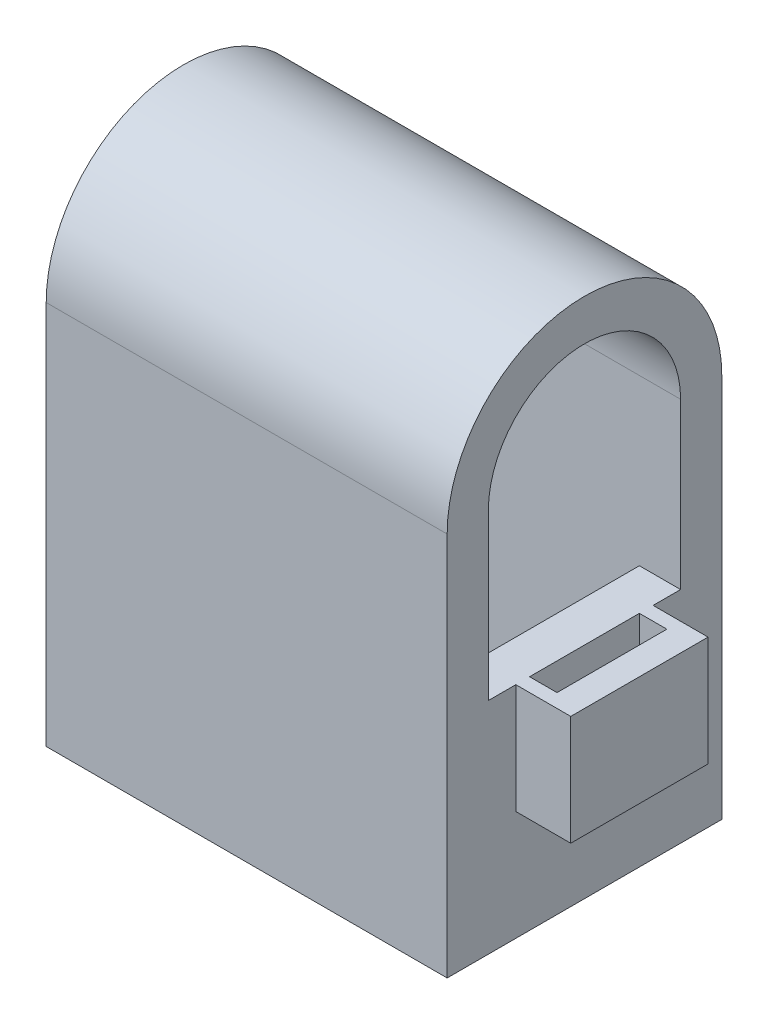
ISO-10303-21;
HEADER;
FILE_DESCRIPTION(('STEP AP214'),'2;1');
FILE_NAME('part.step','',(''),(''),'','','');
FILE_SCHEMA(('AUTOMOTIVE_DESIGN { 1 0 10303 214 1 1 1 1 }'));
ENDSEC;
DATA;
#1=APPLICATION_CONTEXT('core data for automotive mechanical design processes');
#2=APPLICATION_PROTOCOL_DEFINITION('international standard','automotive_design',2000,#1);
#3=PRODUCT_CONTEXT('',#1,'mechanical');
#4=PRODUCT('Part','Part','',(#3));
#5=PRODUCT_RELATED_PRODUCT_CATEGORY('part','',(#4));
#6=PRODUCT_DEFINITION_FORMATION('','',#4);
#7=PRODUCT_DEFINITION_CONTEXT('part definition',#1,'design');
#8=PRODUCT_DEFINITION('design','',#6,#7);
#9=PRODUCT_DEFINITION_SHAPE('','',#8);
#10=(LENGTH_UNIT() NAMED_UNIT(*) SI_UNIT(.MILLI.,.METRE.));
#11=(NAMED_UNIT(*) PLANE_ANGLE_UNIT() SI_UNIT($,.RADIAN.));
#12=(NAMED_UNIT(*) SI_UNIT($,.STERADIAN.) SOLID_ANGLE_UNIT());
#13=UNCERTAINTY_MEASURE_WITH_UNIT(LENGTH_MEASURE(1.E-05),#10,'distance_accuracy_value','');
#14=(GEOMETRIC_REPRESENTATION_CONTEXT(3) GLOBAL_UNCERTAINTY_ASSIGNED_CONTEXT((#13)) GLOBAL_UNIT_ASSIGNED_CONTEXT((#10,
#11,#12)) REPRESENTATION_CONTEXT('',''));
#15=CARTESIAN_POINT('',(0.,0.,0.));
#16=DIRECTION('',(0.,0.,1.));
#17=DIRECTION('',(1.,0.,0.));
#18=AXIS2_PLACEMENT_3D('',#15,#16,#17);
#19=CARTESIAN_POINT('',(9.271,-8.89,-1.905));
#20=DIRECTION('',(1.,0.,0.));
#21=DIRECTION('',(0.,0.,-1.));
#22=AXIS2_PLACEMENT_3D('',#19,#20,#21);
#23=PLANE('',#22);
#24=DIRECTION('',(0.,0.,-1.));
#25=VECTOR('',#24,1.);
#26=CARTESIAN_POINT('',(9.271,-3.81,-3.175));
#27=LINE('',#26,#25);
#28=CARTESIAN_POINT('',(9.271,-3.81,-8.89));
#29=VERTEX_POINT('',#28);
#30=CARTESIAN_POINT('',(9.271,-3.81,-9.525));
#31=VERTEX_POINT('',#30);
#32=EDGE_CURVE('E214',#29,#31,#27,.T.);
#33=ORIENTED_EDGE('',*,*,#32,.F.);
#34=DIRECTION('',(0.,1.,0.));
#35=VECTOR('',#34,1.);
#36=CARTESIAN_POINT('',(9.271,-8.89,-8.89));
#37=LINE('',#36,#35);
#38=CARTESIAN_POINT('',(9.271,1.27,-8.89));
#39=VERTEX_POINT('',#38);
#40=EDGE_CURVE('E177',#29,#39,#37,.T.);
#41=ORIENTED_EDGE('',*,*,#40,.T.);
#42=DIRECTION('',(0.,0.,1.));
#43=VECTOR('',#42,1.);
#44=CARTESIAN_POINT('',(9.271,1.27,-8.89));
#45=LINE('',#44,#43);
#46=CARTESIAN_POINT('',(9.271,1.27,-3.81));
#47=VERTEX_POINT('',#46);
#48=EDGE_CURVE('E180',#39,#47,#45,.T.);
#49=ORIENTED_EDGE('',*,*,#48,.T.);
#50=DIRECTION('',(0.,1.,0.));
#51=VECTOR('',#50,1.);
#52=CARTESIAN_POINT('',(9.271,-8.89,-3.81));
#53=LINE('',#52,#51);
#54=CARTESIAN_POINT('',(9.271,-3.81,-3.81));
#55=VERTEX_POINT('',#54);
#56=EDGE_CURVE('E55',#55,#47,#53,.T.);
#57=ORIENTED_EDGE('',*,*,#56,.F.);
#58=CARTESIAN_POINT('',(9.271,-3.81,-3.175));
#59=VERTEX_POINT('',#58);
#60=EDGE_CURVE('E202',#59,#55,#27,.T.);
#61=ORIENTED_EDGE('',*,*,#60,.F.);
#62=DIRECTION('',(0.,-1.,0.));
#63=VECTOR('',#62,1.);
#64=CARTESIAN_POINT('',(9.271,-3.81,-3.175));
#65=LINE('',#64,#63);
#66=CARTESIAN_POINT('',(9.271,1.27,-3.175));
#67=VERTEX_POINT('',#66);
#68=EDGE_CURVE('E211',#67,#59,#65,.T.);
#69=ORIENTED_EDGE('',*,*,#68,.F.);
#70=DIRECTION('',(0.,0.,1.));
#71=VECTOR('',#70,1.);
#72=CARTESIAN_POINT('',(9.271,1.27,-1.905));
#73=LINE('',#72,#71);
#74=CARTESIAN_POINT('',(9.271,1.27,-1.905));
#75=VERTEX_POINT('',#74);
#76=EDGE_CURVE('E227',#67,#75,#73,.T.);
#77=ORIENTED_EDGE('',*,*,#76,.T.);
#78=DIRECTION('',(0.,1.,0.));
#79=VECTOR('',#78,1.);
#80=CARTESIAN_POINT('',(9.271,-8.89,-1.905));
#81=LINE('',#80,#79);
#82=CARTESIAN_POINT('',(9.271,8.89,-1.905));
#83=VERTEX_POINT('',#82);
#84=EDGE_CURVE('E299',#75,#83,#81,.T.);
#85=ORIENTED_EDGE('',*,*,#84,.T.);
#86=CARTESIAN_POINT('',(9.271,8.89,-6.35));
#87=DIRECTION('',(1.,0.,0.));
#88=DIRECTION('',(0.,0.,-1.));
#89=AXIS2_PLACEMENT_3D('',#86,#87,#88);
#90=CIRCLE('',#89,4.445);
#91=CARTESIAN_POINT('',(9.271,8.89,-10.795));
#92=VERTEX_POINT('',#91);
#93=EDGE_CURVE('E289',#92,#83,#90,.T.);
#94=ORIENTED_EDGE('',*,*,#93,.F.);
#95=DIRECTION('',(0.,1.,0.));
#96=VECTOR('',#95,1.);
#97=CARTESIAN_POINT('',(9.271,-8.89,-10.795));
#98=LINE('',#97,#96);
#99=CARTESIAN_POINT('',(9.271,1.27,-10.795));
#100=VERTEX_POINT('',#99);
#101=EDGE_CURVE('E273',#100,#92,#98,.T.);
#102=ORIENTED_EDGE('',*,*,#101,.F.);
#103=CARTESIAN_POINT('',(9.271,1.27,-9.525));
#104=VERTEX_POINT('',#103);
#105=EDGE_CURVE('E231',#100,#104,#73,.T.);
#106=ORIENTED_EDGE('',*,*,#105,.T.);
#107=DIRECTION('',(0.,1.,0.));
#108=VECTOR('',#107,1.);
#109=CARTESIAN_POINT('',(9.271,-3.81,-9.525));
#110=LINE('',#109,#108);
#111=EDGE_CURVE('E195',#31,#104,#110,.T.);
#112=ORIENTED_EDGE('',*,*,#111,.F.);
#113=EDGE_LOOP('',(#33,#41,#49,#57,#61,#69,#77,#85,#94,#102,#106,#112));
#114=FACE_BOUND('',#113,.T.);
#115=DIRECTION('',(0.,1.,0.));
#116=VECTOR('',#115,1.);
#117=CARTESIAN_POINT('',(9.271,-8.89,0.));
#118=LINE('',#117,#116);
#119=CARTESIAN_POINT('',(9.271,-8.89,0.));
#120=VERTEX_POINT('',#119);
#121=CARTESIAN_POINT('',(9.271,8.89,0.));
#122=VERTEX_POINT('',#121);
#123=EDGE_CURVE('E292',#120,#122,#118,.T.);
#124=ORIENTED_EDGE('',*,*,#123,.F.);
#125=DIRECTION('',(0.,0.,1.));
#126=VECTOR('',#125,1.);
#127=CARTESIAN_POINT('',(9.271,-8.89,-1.905));
#128=LINE('',#127,#126);
#129=CARTESIAN_POINT('',(9.271,-8.89,-12.7));
#130=VERTEX_POINT('',#129);
#131=EDGE_CURVE('E321',#130,#120,#128,.T.);
#132=ORIENTED_EDGE('',*,*,#131,.F.);
#133=DIRECTION('',(0.,1.,0.));
#134=VECTOR('',#133,1.);
#135=CARTESIAN_POINT('',(9.271,-8.89,-12.7));
#136=LINE('',#135,#134);
#137=CARTESIAN_POINT('',(9.271,8.89,-12.7));
#138=VERTEX_POINT('',#137);
#139=EDGE_CURVE('E271',#130,#138,#136,.T.);
#140=ORIENTED_EDGE('',*,*,#139,.T.);
#141=CARTESIAN_POINT('',(9.271,8.89,-6.35));
#142=DIRECTION('',(1.,0.,0.));
#143=DIRECTION('',(0.,0.,-1.));
#144=AXIS2_PLACEMENT_3D('',#141,#142,#143);
#145=CIRCLE('',#144,6.35);
#146=EDGE_CURVE('E286',#122,#138,#145,.F.);
#147=ORIENTED_EDGE('',*,*,#146,.F.);
#148=EDGE_LOOP('',(#124,#132,#140,#147));
#149=FACE_BOUND('',#148,.T.);
#150=ADVANCED_FACE('F33',(#114,#149),#23,.T.);
#151=CARTESIAN_POINT('',(-9.271,-8.89,-1.905));
#152=DIRECTION('',(0.,-1.,0.));
#153=DIRECTION('',(0.,0.,-1.));
#154=AXIS2_PLACEMENT_3D('',#151,#152,#153);
#155=PLANE('',#154);
#156=DIRECTION('',(1.,0.,0.));
#157=VECTOR('',#156,1.);
#158=CARTESIAN_POINT('',(9.271,-8.89,-12.7));
#159=LINE('',#158,#157);
#160=CARTESIAN_POINT('',(-9.271,-8.89,-12.7));
#161=VERTEX_POINT('',#160);
#162=EDGE_CURVE('E278',#161,#130,#159,.T.);
#163=ORIENTED_EDGE('',*,*,#162,.T.);
#164=ORIENTED_EDGE('',*,*,#131,.T.);
#165=DIRECTION('',(1.,0.,0.));
#166=VECTOR('',#165,1.);
#167=CARTESIAN_POINT('',(-9.271,-8.89,0.));
#168=LINE('',#167,#166);
#169=CARTESIAN_POINT('',(-9.271,-8.89,0.));
#170=VERTEX_POINT('',#169);
#171=EDGE_CURVE('E302',#170,#120,#168,.T.);
#172=ORIENTED_EDGE('',*,*,#171,.F.);
#173=DIRECTION('',(0.,0.,1.));
#174=VECTOR('',#173,1.);
#175=CARTESIAN_POINT('',(-9.271,-8.89,-1.905));
#176=LINE('',#175,#174);
#177=EDGE_CURVE('E310',#161,#170,#176,.T.);
#178=ORIENTED_EDGE('',*,*,#177,.F.);
#179=EDGE_LOOP('',(#163,#164,#172,#178));
#180=FACE_BOUND('',#179,.T.);
#181=DIRECTION('',(1.,0.,0.));
#182=VECTOR('',#181,1.);
#183=CARTESIAN_POINT('',(-9.271,-8.89,-1.905));
#184=LINE('',#183,#182);
#185=CARTESIAN_POINT('',(-7.366,-8.89,-1.905));
#186=VERTEX_POINT('',#185);
#187=CARTESIAN_POINT('',(7.366,-8.89,-1.905));
#188=VERTEX_POINT('',#187);
#189=EDGE_CURVE('E307',#186,#188,#184,.T.);
#190=ORIENTED_EDGE('',*,*,#189,.T.);
#191=DIRECTION('',(0.,0.,-1.));
#192=VECTOR('',#191,1.);
#193=CARTESIAN_POINT('',(7.366,-8.89,-1.905));
#194=LINE('',#193,#192);
#195=CARTESIAN_POINT('',(7.366,-8.89,-10.795));
#196=VERTEX_POINT('',#195);
#197=EDGE_CURVE('E237',#188,#196,#194,.T.);
#198=ORIENTED_EDGE('',*,*,#197,.T.);
#199=DIRECTION('',(1.,0.,0.));
#200=VECTOR('',#199,1.);
#201=CARTESIAN_POINT('',(9.271,-8.89,-10.795));
#202=LINE('',#201,#200);
#203=CARTESIAN_POINT('',(-7.366,-8.89,-10.795));
#204=VERTEX_POINT('',#203);
#205=EDGE_CURVE('E270',#204,#196,#202,.T.);
#206=ORIENTED_EDGE('',*,*,#205,.F.);
#207=DIRECTION('',(0.,0.,1.));
#208=VECTOR('',#207,1.);
#209=CARTESIAN_POINT('',(-7.366,-8.89,-10.795));
#210=LINE('',#209,#208);
#211=EDGE_CURVE('E250',#204,#186,#210,.T.);
#212=ORIENTED_EDGE('',*,*,#211,.T.);
#213=EDGE_LOOP('',(#190,#198,#206,#212));
#214=FACE_BOUND('',#213,.T.);
#215=ADVANCED_FACE('F343',(#180,#214),#155,.T.);
#216=CARTESIAN_POINT('',(-9.271,-8.89,-1.905));
#217=DIRECTION('',(-1.,0.,0.));
#218=DIRECTION('',(0.,0.,1.));
#219=AXIS2_PLACEMENT_3D('',#216,#217,#218);
#220=PLANE('',#219);
#221=DIRECTION('',(0.,-1.,0.));
#222=VECTOR('',#221,1.);
#223=CARTESIAN_POINT('',(-9.271,-8.89,-1.905));
#224=LINE('',#223,#222);
#225=CARTESIAN_POINT('',(-9.271,8.89,-1.905));
#226=VERTEX_POINT('',#225);
#227=CARTESIAN_POINT('',(-9.271,1.27,-1.905));
#228=VERTEX_POINT('',#227);
#229=EDGE_CURVE('E304',#226,#228,#224,.T.);
#230=ORIENTED_EDGE('',*,*,#229,.T.);
#231=DIRECTION('',(0.,0.,-1.));
#232=VECTOR('',#231,1.);
#233=CARTESIAN_POINT('',(-9.271,1.27,-10.795));
#234=LINE('',#233,#232);
#235=CARTESIAN_POINT('',(-9.271,1.27,-10.795));
#236=VERTEX_POINT('',#235);
#237=EDGE_CURVE('E245',#228,#236,#234,.T.);
#238=ORIENTED_EDGE('',*,*,#237,.T.);
#239=DIRECTION('',(0.,-1.,0.));
#240=VECTOR('',#239,1.);
#241=CARTESIAN_POINT('',(-9.271,-8.89,-10.795));
#242=LINE('',#241,#240);
#243=CARTESIAN_POINT('',(-9.271,8.89,-10.795));
#244=VERTEX_POINT('',#243);
#245=EDGE_CURVE('E268',#244,#236,#242,.T.);
#246=ORIENTED_EDGE('',*,*,#245,.F.);
#247=CARTESIAN_POINT('',(-9.271,8.89,-6.35));
#248=DIRECTION('',(1.,0.,0.));
#249=DIRECTION('',(0.,0.,-1.));
#250=AXIS2_PLACEMENT_3D('',#247,#248,#249);
#251=CIRCLE('',#250,4.445);
#252=EDGE_CURVE('E275',#244,#226,#251,.T.);
#253=ORIENTED_EDGE('',*,*,#252,.T.);
#254=EDGE_LOOP('',(#230,#238,#246,#253));
#255=FACE_BOUND('',#254,.T.);
#256=DIRECTION('',(0.,-1.,0.));
#257=VECTOR('',#256,1.);
#258=CARTESIAN_POINT('',(-9.271,-8.89,0.));
#259=LINE('',#258,#257);
#260=CARTESIAN_POINT('',(-9.271,8.89,0.));
#261=VERTEX_POINT('',#260);
#262=EDGE_CURVE('E316',#261,#170,#259,.T.);
#263=ORIENTED_EDGE('',*,*,#262,.F.);
#264=CARTESIAN_POINT('',(-9.271,8.89,-6.35));
#265=DIRECTION('',(-1.,0.,0.));
#266=DIRECTION('',(0.,0.,1.));
#267=AXIS2_PLACEMENT_3D('',#264,#265,#266);
#268=CIRCLE('',#267,6.35);
#269=CARTESIAN_POINT('',(-9.271,8.89,-12.7));
#270=VERTEX_POINT('',#269);
#271=EDGE_CURVE('E283',#261,#270,#268,.T.);
#272=ORIENTED_EDGE('',*,*,#271,.T.);
#273=DIRECTION('',(0.,-1.,0.));
#274=VECTOR('',#273,1.);
#275=CARTESIAN_POINT('',(-9.271,-8.89,-12.7));
#276=LINE('',#275,#274);
#277=EDGE_CURVE('E265',#270,#161,#276,.T.);
#278=ORIENTED_EDGE('',*,*,#277,.T.);
#279=ORIENTED_EDGE('',*,*,#177,.T.);
#280=EDGE_LOOP('',(#263,#272,#278,#279));
#281=FACE_BOUND('',#280,.T.);
#282=ADVANCED_FACE('F348',(#255,#281),#220,.T.);
#283=CARTESIAN_POINT('',(0.,0.,-1.905));
#284=DIRECTION('',(0.,0.,-1.));
#285=DIRECTION('',(-1.,0.,0.));
#286=AXIS2_PLACEMENT_3D('',#283,#284,#285);
#287=PLANE('',#286);
#288=DIRECTION('',(1.,0.,0.));
#289=VECTOR('',#288,1.);
#290=CARTESIAN_POINT('',(7.366,1.27,-1.905));
#291=LINE('',#290,#289);
#292=CARTESIAN_POINT('',(7.366,1.27,-1.905));
#293=VERTEX_POINT('',#292);
#294=EDGE_CURVE('E242',#293,#75,#291,.T.);
#295=ORIENTED_EDGE('',*,*,#294,.F.);
#296=DIRECTION('',(0.,-1.,0.));
#297=VECTOR('',#296,1.);
#298=CARTESIAN_POINT('',(7.366,-8.89,-1.905));
#299=LINE('',#298,#297);
#300=EDGE_CURVE('E234',#293,#188,#299,.T.);
#301=ORIENTED_EDGE('',*,*,#300,.T.);
#302=ORIENTED_EDGE('',*,*,#189,.F.);
#303=DIRECTION('',(0.,1.,0.));
#304=VECTOR('',#303,1.);
#305=CARTESIAN_POINT('',(-7.366,-8.89,-1.905));
#306=LINE('',#305,#304);
#307=CARTESIAN_POINT('',(-7.366,1.27,-1.905));
#308=VERTEX_POINT('',#307);
#309=EDGE_CURVE('E253',#186,#308,#306,.T.);
#310=ORIENTED_EDGE('',*,*,#309,.T.);
#311=DIRECTION('',(-1.,0.,0.));
#312=VECTOR('',#311,1.);
#313=CARTESIAN_POINT('',(-7.366,1.27,-1.905));
#314=LINE('',#313,#312);
#315=EDGE_CURVE('E259',#308,#228,#314,.T.);
#316=ORIENTED_EDGE('',*,*,#315,.T.);
#317=ORIENTED_EDGE('',*,*,#229,.F.);
#318=DIRECTION('',(-1.,0.,0.));
#319=VECTOR('',#318,1.);
#320=CARTESIAN_POINT('',(-9.271,8.89,-1.905));
#321=LINE('',#320,#319);
#322=EDGE_CURVE('E301',#83,#226,#321,.T.);
#323=ORIENTED_EDGE('',*,*,#322,.F.);
#324=ORIENTED_EDGE('',*,*,#84,.F.);
#325=EDGE_LOOP('',(#295,#301,#302,#310,#316,#317,#323,#324));
#326=FACE_BOUND('',#325,.T.);
#327=ADVANCED_FACE('F355',(#326),#287,.T.);
#328=CARTESIAN_POINT('',(0.,0.,0.));
#329=DIRECTION('',(0.,0.,-1.));
#330=DIRECTION('',(-1.,0.,0.));
#331=AXIS2_PLACEMENT_3D('',#328,#329,#330);
#332=PLANE('',#331);
#333=ORIENTED_EDGE('',*,*,#123,.T.);
#334=DIRECTION('',(-1.,0.,0.));
#335=VECTOR('',#334,1.);
#336=CARTESIAN_POINT('',(-9.271,8.89,0.));
#337=LINE('',#336,#335);
#338=EDGE_CURVE('E313',#122,#261,#337,.T.);
#339=ORIENTED_EDGE('',*,*,#338,.T.);
#340=ORIENTED_EDGE('',*,*,#262,.T.);
#341=ORIENTED_EDGE('',*,*,#171,.T.);
#342=EDGE_LOOP('',(#333,#339,#340,#341));
#343=FACE_BOUND('',#342,.T.);
#344=ADVANCED_FACE('F359',(#343),#332,.F.);
#345=CARTESIAN_POINT('',(23.4700316571237,8.89,-6.35));
#346=DIRECTION('',(-1.,0.,0.));
#347=DIRECTION('',(0.,0.,1.));
#348=AXIS2_PLACEMENT_3D('',#345,#346,#347);
#349=CYLINDRICAL_SURFACE('',#348,6.35);
#350=ORIENTED_EDGE('',*,*,#338,.F.);
#351=ORIENTED_EDGE('',*,*,#146,.T.);
#352=DIRECTION('',(-1.,0.,0.));
#353=VECTOR('',#352,1.);
#354=CARTESIAN_POINT('',(23.4700316571237,8.89,-12.7));
#355=LINE('',#354,#353);
#356=EDGE_CURVE('E295',#138,#270,#355,.T.);
#357=ORIENTED_EDGE('',*,*,#356,.T.);
#358=ORIENTED_EDGE('',*,*,#271,.F.);
#359=EDGE_LOOP('',(#350,#351,#357,#358));
#360=FACE_BOUND('',#359,.T.);
#361=ADVANCED_FACE('F362',(#360),#349,.T.);
#362=CARTESIAN_POINT('',(23.4700316571237,8.89,-6.35));
#363=DIRECTION('',(-1.,0.,0.));
#364=DIRECTION('',(0.,0.,1.));
#365=AXIS2_PLACEMENT_3D('',#362,#363,#364);
#366=CYLINDRICAL_SURFACE('',#365,4.445);
#367=DIRECTION('',(-1.,0.,0.));
#368=VECTOR('',#367,1.);
#369=CARTESIAN_POINT('',(23.4700316571237,8.89,-10.795));
#370=LINE('',#369,#368);
#371=EDGE_CURVE('E293',#92,#244,#370,.T.);
#372=ORIENTED_EDGE('',*,*,#371,.F.);
#373=ORIENTED_EDGE('',*,*,#93,.T.);
#374=ORIENTED_EDGE('',*,*,#322,.T.);
#375=ORIENTED_EDGE('',*,*,#252,.F.);
#376=EDGE_LOOP('',(#372,#373,#374,#375));
#377=FACE_BOUND('',#376,.T.);
#378=ADVANCED_FACE('F369',(#377),#366,.F.);
#379=CARTESIAN_POINT('',(0.,0.,-10.795));
#380=DIRECTION('',(0.,0.,1.));
#381=DIRECTION('',(1.,0.,0.));
#382=AXIS2_PLACEMENT_3D('',#379,#380,#381);
#383=PLANE('',#382);
#384=DIRECTION('',(1.,0.,0.));
#385=VECTOR('',#384,1.);
#386=CARTESIAN_POINT('',(7.366,1.27,-10.795));
#387=LINE('',#386,#385);
#388=CARTESIAN_POINT('',(7.366,1.27,-10.795));
#389=VERTEX_POINT('',#388);
#390=EDGE_CURVE('E240',#389,#100,#387,.T.);
#391=ORIENTED_EDGE('',*,*,#390,.T.);
#392=ORIENTED_EDGE('',*,*,#101,.T.);
#393=ORIENTED_EDGE('',*,*,#371,.T.);
#394=ORIENTED_EDGE('',*,*,#245,.T.);
#395=DIRECTION('',(-1.,0.,0.));
#396=VECTOR('',#395,1.);
#397=CARTESIAN_POINT('',(-7.366,1.27,-10.795));
#398=LINE('',#397,#396);
#399=CARTESIAN_POINT('',(-7.366,1.27,-10.795));
#400=VERTEX_POINT('',#399);
#401=EDGE_CURVE('E262',#400,#236,#398,.T.);
#402=ORIENTED_EDGE('',*,*,#401,.F.);
#403=DIRECTION('',(0.,-1.,0.));
#404=VECTOR('',#403,1.);
#405=CARTESIAN_POINT('',(-7.366,-8.89,-10.795));
#406=LINE('',#405,#404);
#407=EDGE_CURVE('E248',#400,#204,#406,.T.);
#408=ORIENTED_EDGE('',*,*,#407,.T.);
#409=ORIENTED_EDGE('',*,*,#205,.T.);
#410=DIRECTION('',(0.,1.,0.));
#411=VECTOR('',#410,1.);
#412=CARTESIAN_POINT('',(7.366,-8.89,-10.795));
#413=LINE('',#412,#411);
#414=EDGE_CURVE('E228',#196,#389,#413,.T.);
#415=ORIENTED_EDGE('',*,*,#414,.T.);
#416=EDGE_LOOP('',(#391,#392,#393,#394,#402,#408,#409,#415));
#417=FACE_BOUND('',#416,.T.);
#418=ADVANCED_FACE('F373',(#417),#383,.T.);
#419=CARTESIAN_POINT('',(0.,0.,-12.7));
#420=DIRECTION('',(0.,0.,1.));
#421=DIRECTION('',(1.,0.,0.));
#422=AXIS2_PLACEMENT_3D('',#419,#420,#421);
#423=PLANE('',#422);
#424=ORIENTED_EDGE('',*,*,#277,.F.);
#425=ORIENTED_EDGE('',*,*,#356,.F.);
#426=ORIENTED_EDGE('',*,*,#139,.F.);
#427=ORIENTED_EDGE('',*,*,#162,.F.);
#428=EDGE_LOOP('',(#424,#425,#426,#427));
#429=FACE_BOUND('',#428,.T.);
#430=ADVANCED_FACE('F375',(#429),#423,.F.);
#431=CARTESIAN_POINT('',(-7.366,1.27,-10.795));
#432=DIRECTION('',(0.,1.,0.));
#433=DIRECTION('',(0.,0.,1.));
#434=AXIS2_PLACEMENT_3D('',#431,#432,#433);
#435=PLANE('',#434);
#436=ORIENTED_EDGE('',*,*,#237,.F.);
#437=ORIENTED_EDGE('',*,*,#315,.F.);
#438=DIRECTION('',(0.,0.,-1.));
#439=VECTOR('',#438,1.);
#440=CARTESIAN_POINT('',(-7.366,1.27,-10.795));
#441=LINE('',#440,#439);
#442=EDGE_CURVE('E256',#308,#400,#441,.T.);
#443=ORIENTED_EDGE('',*,*,#442,.T.);
#444=ORIENTED_EDGE('',*,*,#401,.T.);
#445=EDGE_LOOP('',(#436,#437,#443,#444));
#446=FACE_BOUND('',#445,.T.);
#447=ADVANCED_FACE('F378',(#446),#435,.T.);
#448=CARTESIAN_POINT('',(-7.366,0.,0.));
#449=DIRECTION('',(1.,0.,0.));
#450=DIRECTION('',(0.,0.,-1.));
#451=AXIS2_PLACEMENT_3D('',#448,#449,#450);
#452=PLANE('',#451);
#453=ORIENTED_EDGE('',*,*,#407,.F.);
#454=ORIENTED_EDGE('',*,*,#442,.F.);
#455=ORIENTED_EDGE('',*,*,#309,.F.);
#456=ORIENTED_EDGE('',*,*,#211,.F.);
#457=EDGE_LOOP('',(#453,#454,#455,#456));
#458=FACE_BOUND('',#457,.T.);
#459=ADVANCED_FACE('F385',(#458),#452,.T.);
#460=CARTESIAN_POINT('',(7.366,1.27,-1.905));
#461=DIRECTION('',(0.,1.,0.));
#462=DIRECTION('',(0.,0.,1.));
#463=AXIS2_PLACEMENT_3D('',#460,#461,#462);
#464=PLANE('',#463);
#465=DIRECTION('',(-1.,0.,0.));
#466=VECTOR('',#465,1.);
#467=CARTESIAN_POINT('',(10.541,1.27,-8.89));
#468=LINE('',#467,#466);
#469=CARTESIAN_POINT('',(10.541,1.27,-8.89));
#470=VERTEX_POINT('',#469);
#471=EDGE_CURVE('E47',#470,#39,#468,.T.);
#472=ORIENTED_EDGE('',*,*,#471,.F.);
#473=DIRECTION('',(0.,0.,-1.));
#474=VECTOR('',#473,1.);
#475=CARTESIAN_POINT('',(10.541,1.27,-3.81));
#476=LINE('',#475,#474);
#477=CARTESIAN_POINT('',(10.541,1.27,-3.81));
#478=VERTEX_POINT('',#477);
#479=EDGE_CURVE('E188',#478,#470,#476,.T.);
#480=ORIENTED_EDGE('',*,*,#479,.F.);
#481=DIRECTION('',(1.,0.,0.));
#482=VECTOR('',#481,1.);
#483=CARTESIAN_POINT('',(9.271,1.27,-3.81));
#484=LINE('',#483,#482);
#485=EDGE_CURVE('E171',#47,#478,#484,.T.);
#486=ORIENTED_EDGE('',*,*,#485,.F.);
#487=ORIENTED_EDGE('',*,*,#48,.F.);
#488=EDGE_LOOP('',(#472,#480,#486,#487));
#489=FACE_BOUND('',#488,.T.);
#490=ORIENTED_EDGE('',*,*,#105,.F.);
#491=ORIENTED_EDGE('',*,*,#390,.F.);
#492=DIRECTION('',(0.,0.,1.));
#493=VECTOR('',#492,1.);
#494=CARTESIAN_POINT('',(7.366,1.27,-1.905));
#495=LINE('',#494,#493);
#496=EDGE_CURVE('E230',#389,#293,#495,.T.);
#497=ORIENTED_EDGE('',*,*,#496,.T.);
#498=ORIENTED_EDGE('',*,*,#294,.T.);
#499=ORIENTED_EDGE('',*,*,#76,.F.);
#500=DIRECTION('',(-1.,0.,0.));
#501=VECTOR('',#500,1.);
#502=CARTESIAN_POINT('',(11.811,1.27,-3.175));
#503=LINE('',#502,#501);
#504=CARTESIAN_POINT('',(11.811,1.27,-3.175));
#505=VERTEX_POINT('',#504);
#506=EDGE_CURVE('E221',#505,#67,#503,.T.);
#507=ORIENTED_EDGE('',*,*,#506,.F.);
#508=DIRECTION('',(0.,0.,1.));
#509=VECTOR('',#508,1.);
#510=CARTESIAN_POINT('',(11.811,1.27,-3.175));
#511=LINE('',#510,#509);
#512=CARTESIAN_POINT('',(11.811,1.27,-9.525));
#513=VERTEX_POINT('',#512);
#514=EDGE_CURVE('E201',#513,#505,#511,.T.);
#515=ORIENTED_EDGE('',*,*,#514,.F.);
#516=DIRECTION('',(-1.,0.,0.));
#517=VECTOR('',#516,1.);
#518=CARTESIAN_POINT('',(11.811,1.27,-9.525));
#519=LINE('',#518,#517);
#520=EDGE_CURVE('E224',#513,#104,#519,.T.);
#521=ORIENTED_EDGE('',*,*,#520,.T.);
#522=EDGE_LOOP('',(#490,#491,#497,#498,#499,#507,#515,#521));
#523=FACE_BOUND('',#522,.T.);
#524=ADVANCED_FACE('F185',(#489,#523),#464,.T.);
#525=CARTESIAN_POINT('',(7.366,0.,0.));
#526=DIRECTION('',(-1.,0.,0.));
#527=DIRECTION('',(0.,0.,1.));
#528=AXIS2_PLACEMENT_3D('',#525,#526,#527);
#529=PLANE('',#528);
#530=ORIENTED_EDGE('',*,*,#414,.F.);
#531=ORIENTED_EDGE('',*,*,#197,.F.);
#532=ORIENTED_EDGE('',*,*,#300,.F.);
#533=ORIENTED_EDGE('',*,*,#496,.F.);
#534=EDGE_LOOP('',(#530,#531,#532,#533));
#535=FACE_BOUND('',#534,.T.);
#536=ADVANCED_FACE('F390',(#535),#529,.T.);
#537=CARTESIAN_POINT('',(11.811,-3.81,-9.525));
#538=DIRECTION('',(0.,0.,1.));
#539=DIRECTION('',(1.,0.,0.));
#540=AXIS2_PLACEMENT_3D('',#537,#538,#539);
#541=PLANE('',#540);
#542=ORIENTED_EDGE('',*,*,#111,.T.);
#543=ORIENTED_EDGE('',*,*,#520,.F.);
#544=DIRECTION('',(0.,1.,0.));
#545=VECTOR('',#544,1.);
#546=CARTESIAN_POINT('',(11.811,-3.81,-9.525));
#547=LINE('',#546,#545);
#548=CARTESIAN_POINT('',(11.811,-3.81,-9.525));
#549=VERTEX_POINT('',#548);
#550=EDGE_CURVE('E198',#549,#513,#547,.T.);
#551=ORIENTED_EDGE('',*,*,#550,.F.);
#552=DIRECTION('',(-1.,0.,0.));
#553=VECTOR('',#552,1.);
#554=CARTESIAN_POINT('',(11.811,-3.81,-9.525));
#555=LINE('',#554,#553);
#556=EDGE_CURVE('E208',#549,#31,#555,.T.);
#557=ORIENTED_EDGE('',*,*,#556,.T.);
#558=EDGE_LOOP('',(#542,#543,#551,#557));
#559=FACE_BOUND('',#558,.T.);
#560=ADVANCED_FACE('F393',(#559),#541,.F.);
#561=CARTESIAN_POINT('',(11.811,-3.81,-3.175));
#562=DIRECTION('',(0.,0.,-1.));
#563=DIRECTION('',(-1.,0.,0.));
#564=AXIS2_PLACEMENT_3D('',#561,#562,#563);
#565=PLANE('',#564);
#566=ORIENTED_EDGE('',*,*,#68,.T.);
#567=DIRECTION('',(-1.,0.,0.));
#568=VECTOR('',#567,1.);
#569=CARTESIAN_POINT('',(11.811,-3.81,-3.175));
#570=LINE('',#569,#568);
#571=CARTESIAN_POINT('',(11.811,-3.81,-3.175));
#572=VERTEX_POINT('',#571);
#573=EDGE_CURVE('E218',#572,#59,#570,.T.);
#574=ORIENTED_EDGE('',*,*,#573,.F.);
#575=DIRECTION('',(0.,-1.,0.));
#576=VECTOR('',#575,1.);
#577=CARTESIAN_POINT('',(11.811,-3.81,-3.175));
#578=LINE('',#577,#576);
#579=EDGE_CURVE('E204',#505,#572,#578,.T.);
#580=ORIENTED_EDGE('',*,*,#579,.F.);
#581=ORIENTED_EDGE('',*,*,#506,.T.);
#582=EDGE_LOOP('',(#566,#574,#580,#581));
#583=FACE_BOUND('',#582,.T.);
#584=ADVANCED_FACE('F397',(#583),#565,.F.);
#585=CARTESIAN_POINT('',(11.811,-3.81,-3.175));
#586=DIRECTION('',(0.,1.,0.));
#587=DIRECTION('',(0.,0.,1.));
#588=AXIS2_PLACEMENT_3D('',#585,#586,#587);
#589=PLANE('',#588);
#590=DIRECTION('',(0.,0.,-1.));
#591=VECTOR('',#590,1.);
#592=CARTESIAN_POINT('',(10.541,-3.81,-3.175));
#593=LINE('',#592,#591);
#594=CARTESIAN_POINT('',(10.541,-3.81,-3.81));
#595=VERTEX_POINT('',#594);
#596=CARTESIAN_POINT('',(10.541,-3.81,-8.89));
#597=VERTEX_POINT('',#596);
#598=EDGE_CURVE('E40',#595,#597,#593,.T.);
#599=ORIENTED_EDGE('',*,*,#598,.T.);
#600=DIRECTION('',(-1.,0.,0.));
#601=VECTOR('',#600,1.);
#602=CARTESIAN_POINT('',(11.811,-3.81,-8.89));
#603=LINE('',#602,#601);
#604=EDGE_CURVE('E11',#597,#29,#603,.T.);
#605=ORIENTED_EDGE('',*,*,#604,.T.);
#606=ORIENTED_EDGE('',*,*,#32,.T.);
#607=ORIENTED_EDGE('',*,*,#556,.F.);
#608=DIRECTION('',(0.,0.,-1.));
#609=VECTOR('',#608,1.);
#610=CARTESIAN_POINT('',(11.811,-3.81,-3.175));
#611=LINE('',#610,#609);
#612=EDGE_CURVE('E206',#572,#549,#611,.T.);
#613=ORIENTED_EDGE('',*,*,#612,.F.);
#614=ORIENTED_EDGE('',*,*,#573,.T.);
#615=ORIENTED_EDGE('',*,*,#60,.T.);
#616=DIRECTION('',(1.,0.,0.));
#617=VECTOR('',#616,1.);
#618=CARTESIAN_POINT('',(11.811,-3.81,-3.81));
#619=LINE('',#618,#617);
#620=EDGE_CURVE('E174',#55,#595,#619,.T.);
#621=ORIENTED_EDGE('',*,*,#620,.T.);
#622=EDGE_LOOP('',(#599,#605,#606,#607,#613,#614,#615,#621));
#623=FACE_BOUND('',#622,.T.);
#624=ADVANCED_FACE('F326',(#623),#589,.F.);
#625=CARTESIAN_POINT('',(11.811,0.,0.));
#626=DIRECTION('',(-1.,0.,0.));
#627=DIRECTION('',(0.,0.,1.));
#628=AXIS2_PLACEMENT_3D('',#625,#626,#627);
#629=PLANE('',#628);
#630=ORIENTED_EDGE('',*,*,#550,.T.);
#631=ORIENTED_EDGE('',*,*,#514,.T.);
#632=ORIENTED_EDGE('',*,*,#579,.T.);
#633=ORIENTED_EDGE('',*,*,#612,.T.);
#634=EDGE_LOOP('',(#630,#631,#632,#633));
#635=FACE_BOUND('',#634,.T.);
#636=ADVANCED_FACE('F332',(#635),#629,.F.);
#637=CARTESIAN_POINT('',(10.541,-8.89,-8.89));
#638=DIRECTION('',(0.,0.,-1.));
#639=DIRECTION('',(-1.,0.,0.));
#640=AXIS2_PLACEMENT_3D('',#637,#638,#639);
#641=PLANE('',#640);
#642=DIRECTION('',(0.,1.,0.));
#643=VECTOR('',#642,1.);
#644=CARTESIAN_POINT('',(10.541,-8.89,-8.89));
#645=LINE('',#644,#643);
#646=EDGE_CURVE('E193',#597,#470,#645,.T.);
#647=ORIENTED_EDGE('',*,*,#646,.T.);
#648=ORIENTED_EDGE('',*,*,#471,.T.);
#649=ORIENTED_EDGE('',*,*,#40,.F.);
#650=ORIENTED_EDGE('',*,*,#604,.F.);
#651=EDGE_LOOP('',(#647,#648,#649,#650));
#652=FACE_BOUND('',#651,.T.);
#653=ADVANCED_FACE('F330',(#652),#641,.F.);
#654=CARTESIAN_POINT('',(10.541,-8.89,-3.81));
#655=DIRECTION('',(1.,0.,0.));
#656=DIRECTION('',(0.,0.,-1.));
#657=AXIS2_PLACEMENT_3D('',#654,#655,#656);
#658=PLANE('',#657);
#659=DIRECTION('',(0.,1.,0.));
#660=VECTOR('',#659,1.);
#661=CARTESIAN_POINT('',(10.541,-8.89,-3.81));
#662=LINE('',#661,#660);
#663=EDGE_CURVE('E176',#595,#478,#662,.T.);
#664=ORIENTED_EDGE('',*,*,#663,.T.);
#665=ORIENTED_EDGE('',*,*,#479,.T.);
#666=ORIENTED_EDGE('',*,*,#646,.F.);
#667=ORIENTED_EDGE('',*,*,#598,.F.);
#668=EDGE_LOOP('',(#664,#665,#666,#667));
#669=FACE_BOUND('',#668,.T.);
#670=ADVANCED_FACE('F329',(#669),#658,.F.);
#671=CARTESIAN_POINT('',(9.271,-8.89,-3.81));
#672=DIRECTION('',(0.,0.,1.));
#673=DIRECTION('',(1.,0.,0.));
#674=AXIS2_PLACEMENT_3D('',#671,#672,#673);
#675=PLANE('',#674);
#676=ORIENTED_EDGE('',*,*,#56,.T.);
#677=ORIENTED_EDGE('',*,*,#485,.T.);
#678=ORIENTED_EDGE('',*,*,#663,.F.);
#679=ORIENTED_EDGE('',*,*,#620,.F.);
#680=EDGE_LOOP('',(#676,#677,#678,#679));
#681=FACE_BOUND('',#680,.T.);
#682=ADVANCED_FACE('F168',(#681),#675,.F.);
#683=CLOSED_SHELL('',(#150,#215,#282,#327,#344,#361,#378,#418,#430,#447,#459,#524,#536,#560,
#584,#624,#636,#653,#670,#682));
#684=MANIFOLD_SOLID_BREP('B2',#683);
#685=ADVANCED_BREP_SHAPE_REPRESENTATION('',(#18,#684),#14);
#686=SHAPE_DEFINITION_REPRESENTATION(#9,#685);
ENDSEC;
END-ISO-10303-21;
